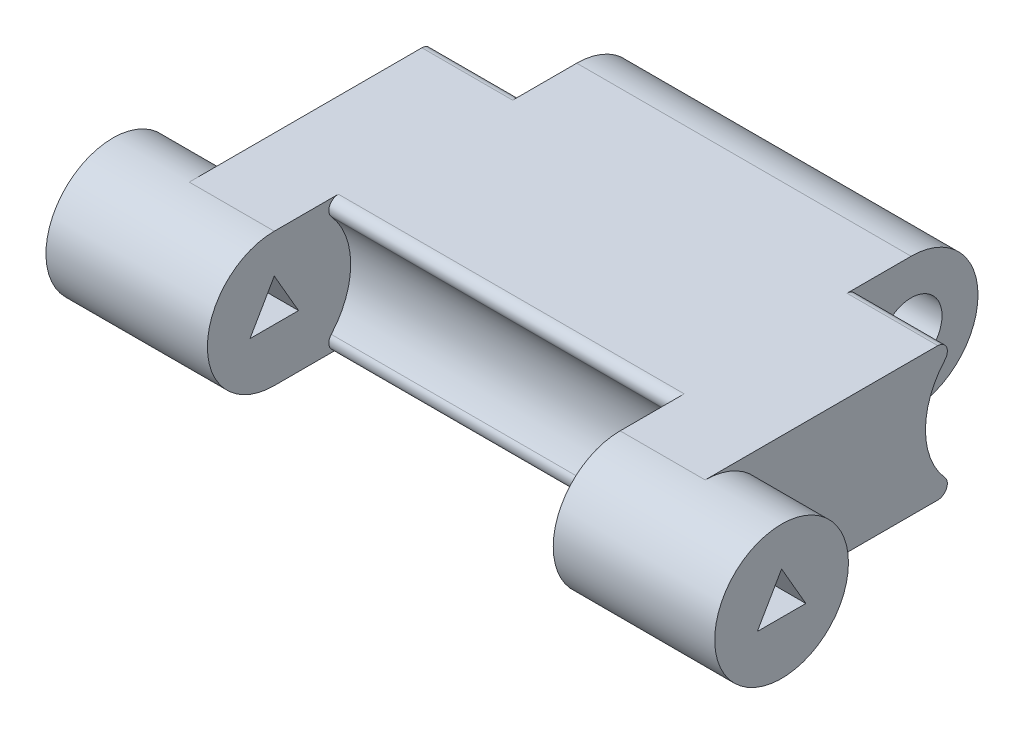
ISO-10303-21;
HEADER;
FILE_DESCRIPTION(('STEP AP214'),'2;1');
FILE_NAME('part.step','',(''),(''),'','','');
FILE_SCHEMA(('AUTOMOTIVE_DESIGN { 1 0 10303 214 1 1 1 1 }'));
ENDSEC;
DATA;
#1=APPLICATION_CONTEXT('core data for automotive mechanical design processes');
#2=APPLICATION_PROTOCOL_DEFINITION('international standard','automotive_design',2000,#1);
#3=PRODUCT_CONTEXT('',#1,'mechanical');
#4=PRODUCT('Part','Part','',(#3));
#5=PRODUCT_RELATED_PRODUCT_CATEGORY('part','',(#4));
#6=PRODUCT_DEFINITION_FORMATION('','',#4);
#7=PRODUCT_DEFINITION_CONTEXT('part definition',#1,'design');
#8=PRODUCT_DEFINITION('design','',#6,#7);
#9=PRODUCT_DEFINITION_SHAPE('','',#8);
#10=(LENGTH_UNIT() NAMED_UNIT(*) SI_UNIT(.MILLI.,.METRE.));
#11=(NAMED_UNIT(*) PLANE_ANGLE_UNIT() SI_UNIT($,.RADIAN.));
#12=(NAMED_UNIT(*) SI_UNIT($,.STERADIAN.) SOLID_ANGLE_UNIT());
#13=UNCERTAINTY_MEASURE_WITH_UNIT(LENGTH_MEASURE(1.E-05),#10,'distance_accuracy_value','');
#14=(GEOMETRIC_REPRESENTATION_CONTEXT(3) GLOBAL_UNCERTAINTY_ASSIGNED_CONTEXT((#13)) GLOBAL_UNIT_ASSIGNED_CONTEXT((#10,
#11,#12)) REPRESENTATION_CONTEXT('',''));
#15=CARTESIAN_POINT('',(0.,0.,0.));
#16=DIRECTION('',(0.,0.,1.));
#17=DIRECTION('',(1.,0.,0.));
#18=AXIS2_PLACEMENT_3D('',#15,#16,#17);
#19=CARTESIAN_POINT('',(-17.5,2.76666666666667,6.49482940778282));
#20=DIRECTION('',(0.,-1.,0.));
#21=DIRECTION('',(0.,0.,-1.));
#22=AXIS2_PLACEMENT_3D('',#19,#20,#21);
#23=PLANE('',#22);
#24=DIRECTION('',(0.,0.,-1.));
#25=VECTOR('',#24,1.);
#26=CARTESIAN_POINT('',(-16.5,2.76666666666667,6.49482940778282));
#27=LINE('',#26,#25);
#28=CARTESIAN_POINT('',(-16.5,2.76666666666667,9.03517059221718));
#29=VERTEX_POINT('',#28);
#30=CARTESIAN_POINT('',(-16.5,2.76666666666667,7.92223301886761));
#31=VERTEX_POINT('',#30);
#32=EDGE_CURVE('E248',#29,#31,#27,.T.);
#33=ORIENTED_EDGE('',*,*,#32,.F.);
#34=DIRECTION('',(1.,0.,0.));
#35=VECTOR('',#34,1.);
#36=CARTESIAN_POINT('',(-17.5,2.76666666666667,9.03517059221718));
#37=LINE('',#36,#35);
#38=CARTESIAN_POINT('',(-9.05,2.76666666666667,9.03517059221718));
#39=VERTEX_POINT('',#38);
#40=EDGE_CURVE('E245',#29,#39,#37,.T.);
#41=ORIENTED_EDGE('',*,*,#40,.T.);
#42=DIRECTION('',(0.,0.,-1.));
#43=VECTOR('',#42,1.);
#44=CARTESIAN_POINT('',(-9.05,2.76666666666667,7.765));
#45=LINE('',#44,#43);
#46=CARTESIAN_POINT('',(-9.05,2.76666666666667,6.49482940778282));
#47=VERTEX_POINT('',#46);
#48=EDGE_CURVE('E436',#39,#47,#45,.T.);
#49=ORIENTED_EDGE('',*,*,#48,.T.);
#50=DIRECTION('',(1.,0.,0.));
#51=VECTOR('',#50,1.);
#52=CARTESIAN_POINT('',(-17.5,2.76666666666667,6.49482940778282));
#53=LINE('',#52,#51);
#54=CARTESIAN_POINT('',(-16.5,2.76666666666667,6.49482940778282));
#55=VERTEX_POINT('',#54);
#56=EDGE_CURVE('E456',#55,#47,#53,.T.);
#57=ORIENTED_EDGE('',*,*,#56,.F.);
#58=CARTESIAN_POINT('',(-16.5,2.76666666666667,7.60776698113239));
#59=VERTEX_POINT('',#58);
#60=EDGE_CURVE('E64',#59,#55,#27,.T.);
#61=ORIENTED_EDGE('',*,*,#60,.F.);
#62=DIRECTION('',(-1.,0.,0.));
#63=VECTOR('',#62,1.);
#64=CARTESIAN_POINT('',(-16.5,2.76666666666667,7.60776698113239));
#65=LINE('',#64,#63);
#66=CARTESIAN_POINT('',(-17.5,2.76666666666667,7.60776698113239));
#67=VERTEX_POINT('',#66);
#68=EDGE_CURVE('E472',#67,#59,#65,.F.);
#69=ORIENTED_EDGE('',*,*,#68,.F.);
#70=DIRECTION('',(0.,0.,-1.));
#71=VECTOR('',#70,1.);
#72=CARTESIAN_POINT('',(-17.5,2.76666666666667,6.49482940778282));
#73=LINE('',#72,#71);
#74=CARTESIAN_POINT('',(-17.5,2.76666666666667,7.92223301886761));
#75=VERTEX_POINT('',#74);
#76=EDGE_CURVE('E448',#75,#67,#73,.T.);
#77=ORIENTED_EDGE('',*,*,#76,.F.);
#78=DIRECTION('',(-1.,0.,0.));
#79=VECTOR('',#78,1.);
#80=CARTESIAN_POINT('',(-16.5,2.76666666666667,7.92223301886761));
#81=LINE('',#80,#79);
#82=EDGE_CURVE('E57',#31,#75,#81,.T.);
#83=ORIENTED_EDGE('',*,*,#82,.F.);
#84=EDGE_LOOP('',(#33,#41,#49,#57,#61,#69,#77,#83));
#85=FACE_BOUND('',#84,.T.);
#86=ADVANCED_FACE('F41',(#85),#23,.F.);
#87=CARTESIAN_POINT('',(-17.5,2.76666666666667,9.03517059221718));
#88=DIRECTION('',(0.,0.5,0.866025403784439));
#89=DIRECTION('',(0.,-0.866025403784439,0.5));
#90=AXIS2_PLACEMENT_3D('',#87,#88,#89);
#91=PLANE('',#90);
#92=DIRECTION('',(0.,-0.866025403784439,0.5));
#93=VECTOR('',#92,1.);
#94=CARTESIAN_POINT('',(-16.5,2.76666666666667,9.03517059221718));
#95=LINE('',#94,#93);
#96=CARTESIAN_POINT('',(-16.5,4.96666666666667,7.765));
#97=VERTEX_POINT('',#96);
#98=CARTESIAN_POINT('',(-16.5,4.00283445531973,8.32146878667479));
#99=VERTEX_POINT('',#98);
#100=EDGE_CURVE('E250',#97,#99,#95,.T.);
#101=ORIENTED_EDGE('',*,*,#100,.F.);
#102=DIRECTION('',(1.,0.,0.));
#103=VECTOR('',#102,1.);
#104=CARTESIAN_POINT('',(-17.5,4.96666666666667,7.765));
#105=LINE('',#104,#103);
#106=CARTESIAN_POINT('',(-9.05,4.96666666666667,7.765));
#107=VERTEX_POINT('',#106);
#108=EDGE_CURVE('E466',#97,#107,#105,.T.);
#109=ORIENTED_EDGE('',*,*,#108,.T.);
#110=DIRECTION('',(0.,-0.866025403784439,0.5));
#111=VECTOR('',#110,1.);
#112=CARTESIAN_POINT('',(-9.05,3.86666666666667,8.40008529610859));
#113=LINE('',#112,#111);
#114=EDGE_CURVE('E441',#107,#39,#113,.T.);
#115=ORIENTED_EDGE('',*,*,#114,.T.);
#116=ORIENTED_EDGE('',*,*,#40,.F.);
#117=CARTESIAN_POINT('',(-16.5,3.7304988780136,8.47870180554239));
#118=VERTEX_POINT('',#117);
#119=EDGE_CURVE('E239',#118,#29,#95,.T.);
#120=ORIENTED_EDGE('',*,*,#119,.F.);
#121=DIRECTION('',(-1.,0.,0.));
#122=VECTOR('',#121,1.);
#123=CARTESIAN_POINT('',(-16.5,3.7304988780136,8.47870180554239));
#124=LINE('',#123,#122);
#125=CARTESIAN_POINT('',(-17.5,3.7304988780136,8.47870180554239));
#126=VERTEX_POINT('',#125);
#127=EDGE_CURVE('E242',#126,#118,#124,.F.);
#128=ORIENTED_EDGE('',*,*,#127,.F.);
#129=DIRECTION('',(0.,-0.866025403784439,0.5));
#130=VECTOR('',#129,1.);
#131=CARTESIAN_POINT('',(-17.5,2.76666666666667,9.03517059221718));
#132=LINE('',#131,#130);
#133=CARTESIAN_POINT('',(-17.5,4.00283445531973,8.32146878667479));
#134=VERTEX_POINT('',#133);
#135=EDGE_CURVE('E454',#134,#126,#132,.T.);
#136=ORIENTED_EDGE('',*,*,#135,.F.);
#137=DIRECTION('',(-1.,0.,0.));
#138=VECTOR('',#137,1.);
#139=CARTESIAN_POINT('',(-16.5,4.00283445531973,8.32146878667479));
#140=LINE('',#139,#138);
#141=EDGE_CURVE('E258',#99,#134,#140,.T.);
#142=ORIENTED_EDGE('',*,*,#141,.F.);
#143=EDGE_LOOP('',(#101,#109,#115,#116,#120,#128,#136,#142));
#144=FACE_BOUND('',#143,.T.);
#145=ADVANCED_FACE('F241',(#144),#91,.F.);
#146=CARTESIAN_POINT('',(-17.5,4.96666666666667,7.765));
#147=DIRECTION('',(0.,0.5,-0.866025403784438));
#148=DIRECTION('',(0.,0.866025403784438,0.5));
#149=AXIS2_PLACEMENT_3D('',#146,#147,#148);
#150=PLANE('',#149);
#151=DIRECTION('',(0.,0.866025403784438,0.5));
#152=VECTOR('',#151,1.);
#153=CARTESIAN_POINT('',(-16.5,4.96666666666667,7.765));
#154=LINE('',#153,#152);
#155=CARTESIAN_POINT('',(-16.5,3.7304988780136,7.05129819445761));
#156=VERTEX_POINT('',#155);
#157=EDGE_CURVE('E11',#55,#156,#154,.T.);
#158=ORIENTED_EDGE('',*,*,#157,.F.);
#159=ORIENTED_EDGE('',*,*,#56,.T.);
#160=DIRECTION('',(0.,0.866025403784438,0.5));
#161=VECTOR('',#160,1.);
#162=CARTESIAN_POINT('',(-9.05,3.86666666666667,7.12991470389141));
#163=LINE('',#162,#161);
#164=EDGE_CURVE('E443',#47,#107,#163,.T.);
#165=ORIENTED_EDGE('',*,*,#164,.T.);
#166=ORIENTED_EDGE('',*,*,#108,.F.);
#167=CARTESIAN_POINT('',(-16.5,4.00283445531973,7.20853121332521));
#168=VERTEX_POINT('',#167);
#169=EDGE_CURVE('E50',#168,#97,#154,.T.);
#170=ORIENTED_EDGE('',*,*,#169,.F.);
#171=DIRECTION('',(-1.,0.,0.));
#172=VECTOR('',#171,1.);
#173=CARTESIAN_POINT('',(-16.5,4.00283445531973,7.20853121332521));
#174=LINE('',#173,#172);
#175=CARTESIAN_POINT('',(-17.5,4.00283445531973,7.20853121332521));
#176=VERTEX_POINT('',#175);
#177=EDGE_CURVE('E280',#176,#168,#174,.F.);
#178=ORIENTED_EDGE('',*,*,#177,.F.);
#179=DIRECTION('',(0.,0.866025403784438,0.5));
#180=VECTOR('',#179,1.);
#181=CARTESIAN_POINT('',(-17.5,4.96666666666667,7.765));
#182=LINE('',#181,#180);
#183=CARTESIAN_POINT('',(-17.5,3.7304988780136,7.05129819445761));
#184=VERTEX_POINT('',#183);
#185=EDGE_CURVE('E452',#184,#176,#182,.T.);
#186=ORIENTED_EDGE('',*,*,#185,.F.);
#187=DIRECTION('',(-1.,0.,0.));
#188=VECTOR('',#187,1.);
#189=CARTESIAN_POINT('',(-16.5,3.7304988780136,7.05129819445761));
#190=LINE('',#189,#188);
#191=EDGE_CURVE('E45',#156,#184,#190,.T.);
#192=ORIENTED_EDGE('',*,*,#191,.F.);
#193=EDGE_LOOP('',(#158,#159,#165,#166,#170,#178,#186,#192));
#194=FACE_BOUND('',#193,.T.);
#195=ADVANCED_FACE('F490',(#194),#150,.F.);
#196=CARTESIAN_POINT('',(17.5,3.5,-7.765));
#197=DIRECTION('',(-1.,0.,0.));
#198=DIRECTION('',(0.,0.,1.));
#199=AXIS2_PLACEMENT_3D('',#196,#197,#198);
#200=CYLINDRICAL_SURFACE('',#199,3.5);
#201=CARTESIAN_POINT('',(-8.75,3.5,-7.765));
#202=DIRECTION('',(-1.,0.,0.));
#203=DIRECTION('',(0.,0.,1.));
#204=AXIS2_PLACEMENT_3D('',#201,#202,#203);
#205=CIRCLE('',#204,3.5);
#206=CARTESIAN_POINT('',(-8.75,7.,-7.765));
#207=VERTEX_POINT('',#206);
#208=CARTESIAN_POINT('',(-8.75,0.,-7.765));
#209=VERTEX_POINT('',#208);
#210=EDGE_CURVE('E430',#207,#209,#205,.T.);
#211=ORIENTED_EDGE('',*,*,#210,.F.);
#212=DIRECTION('',(-1.,0.,0.));
#213=VECTOR('',#212,1.);
#214=CARTESIAN_POINT('',(17.5,7.,-7.765));
#215=LINE('',#214,#213);
#216=CARTESIAN_POINT('',(8.75,7.,-7.765));
#217=VERTEX_POINT('',#216);
#218=EDGE_CURVE('E376',#217,#207,#215,.T.);
#219=ORIENTED_EDGE('',*,*,#218,.F.);
#220=CARTESIAN_POINT('',(8.75,3.5,-7.765));
#221=DIRECTION('',(1.,0.,0.));
#222=DIRECTION('',(0.,0.,-1.));
#223=AXIS2_PLACEMENT_3D('',#220,#221,#222);
#224=CIRCLE('',#223,3.5);
#225=CARTESIAN_POINT('',(8.75,0.,-7.765));
#226=VERTEX_POINT('',#225);
#227=EDGE_CURVE('E360',#226,#217,#224,.T.);
#228=ORIENTED_EDGE('',*,*,#227,.F.);
#229=DIRECTION('',(-1.,0.,0.));
#230=VECTOR('',#229,1.);
#231=CARTESIAN_POINT('',(17.5,0.,-7.765));
#232=LINE('',#231,#230);
#233=EDGE_CURVE('E373',#226,#209,#232,.T.);
#234=ORIENTED_EDGE('',*,*,#233,.T.);
#235=EDGE_LOOP('',(#211,#219,#228,#234));
#236=FACE_BOUND('',#235,.T.);
#237=ADVANCED_FACE('F563',(#236),#200,.T.);
#238=CARTESIAN_POINT('',(17.5,0.,7.765));
#239=DIRECTION('',(0.,1.,0.));
#240=DIRECTION('',(0.,0.,1.));
#241=AXIS2_PLACEMENT_3D('',#238,#239,#240);
#242=PLANE('',#241);
#243=DIRECTION('',(0.,0.,1.));
#244=VECTOR('',#243,1.);
#245=CARTESIAN_POINT('',(-13.5,0.,7.765));
#246=LINE('',#245,#244);
#247=CARTESIAN_POINT('',(-13.5,0.,-4.41089803375031));
#248=VERTEX_POINT('',#247);
#249=CARTESIAN_POINT('',(-13.5,0.,7.765));
#250=VERTEX_POINT('',#249);
#251=EDGE_CURVE('E395',#248,#250,#246,.T.);
#252=ORIENTED_EDGE('',*,*,#251,.F.);
#253=DIRECTION('',(1.,0.,0.));
#254=VECTOR('',#253,1.);
#255=CARTESIAN_POINT('',(-8.75,0.,-4.41089803375031));
#256=LINE('',#255,#254);
#257=CARTESIAN_POINT('',(-8.75,0.,-4.41089803375031));
#258=VERTEX_POINT('',#257);
#259=EDGE_CURVE('E325',#248,#258,#256,.T.);
#260=ORIENTED_EDGE('',*,*,#259,.T.);
#261=DIRECTION('',(0.,0.,1.));
#262=VECTOR('',#261,1.);
#263=CARTESIAN_POINT('',(-8.75,0.,7.765));
#264=LINE('',#263,#262);
#265=EDGE_CURVE('E426',#209,#258,#264,.T.);
#266=ORIENTED_EDGE('',*,*,#265,.F.);
#267=ORIENTED_EDGE('',*,*,#233,.F.);
#268=DIRECTION('',(0.,0.,-1.));
#269=VECTOR('',#268,1.);
#270=CARTESIAN_POINT('',(8.75,0.,7.765));
#271=LINE('',#270,#269);
#272=CARTESIAN_POINT('',(8.75,0.,-4.41089803375031));
#273=VERTEX_POINT('',#272);
#274=EDGE_CURVE('E416',#273,#226,#271,.T.);
#275=ORIENTED_EDGE('',*,*,#274,.F.);
#276=DIRECTION('',(1.,0.,0.));
#277=VECTOR('',#276,1.);
#278=CARTESIAN_POINT('',(17.5,0.,-4.41089803375031));
#279=LINE('',#278,#277);
#280=CARTESIAN_POINT('',(13.5,0.,-4.41089803375031));
#281=VERTEX_POINT('',#280);
#282=EDGE_CURVE('E331',#273,#281,#279,.T.);
#283=ORIENTED_EDGE('',*,*,#282,.T.);
#284=DIRECTION('',(0.,0.,-1.));
#285=VECTOR('',#284,1.);
#286=CARTESIAN_POINT('',(13.5,0.,7.765));
#287=LINE('',#286,#285);
#288=CARTESIAN_POINT('',(13.5,0.,7.765));
#289=VERTEX_POINT('',#288);
#290=EDGE_CURVE('E387',#289,#281,#287,.T.);
#291=ORIENTED_EDGE('',*,*,#290,.F.);
#292=DIRECTION('',(-1.,0.,0.));
#293=VECTOR('',#292,1.);
#294=CARTESIAN_POINT('',(17.5,0.,7.765));
#295=LINE('',#294,#293);
#296=CARTESIAN_POINT('',(9.05,0.,7.765));
#297=VERTEX_POINT('',#296);
#298=EDGE_CURVE('E369',#289,#297,#295,.T.);
#299=ORIENTED_EDGE('',*,*,#298,.T.);
#300=DIRECTION('',(0.,0.,-1.));
#301=VECTOR('',#300,1.);
#302=CARTESIAN_POINT('',(9.05,0.,7.765));
#303=LINE('',#302,#301);
#304=CARTESIAN_POINT('',(9.05,0.,4.41089803375031));
#305=VERTEX_POINT('',#304);
#306=EDGE_CURVE('E407',#297,#305,#303,.T.);
#307=ORIENTED_EDGE('',*,*,#306,.T.);
#308=DIRECTION('',(1.,0.,0.));
#309=VECTOR('',#308,1.);
#310=CARTESIAN_POINT('',(17.5,0.,4.41089803375031));
#311=LINE('',#310,#309);
#312=CARTESIAN_POINT('',(-9.05,0.,4.41089803375031));
#313=VERTEX_POINT('',#312);
#314=EDGE_CURVE('E328',#305,#313,#311,.F.);
#315=ORIENTED_EDGE('',*,*,#314,.T.);
#316=DIRECTION('',(0.,0.,-1.));
#317=VECTOR('',#316,1.);
#318=CARTESIAN_POINT('',(-9.05,0.,7.765));
#319=LINE('',#318,#317);
#320=CARTESIAN_POINT('',(-9.05,0.,7.765));
#321=VERTEX_POINT('',#320);
#322=EDGE_CURVE('E403',#321,#313,#319,.T.);
#323=ORIENTED_EDGE('',*,*,#322,.F.);
#324=EDGE_CURVE('E372',#321,#250,#295,.T.);
#325=ORIENTED_EDGE('',*,*,#324,.T.);
#326=EDGE_LOOP('',(#252,#260,#266,#267,#275,#283,#291,#299,#307,#315,#323,#325));
#327=FACE_BOUND('',#326,.T.);
#328=ADVANCED_FACE('F542',(#327),#242,.F.);
#329=CARTESIAN_POINT('',(17.5,7.,7.765));
#330=DIRECTION('',(0.,-1.,0.));
#331=DIRECTION('',(0.,0.,-1.));
#332=AXIS2_PLACEMENT_3D('',#329,#330,#331);
#333=PLANE('',#332);
#334=DIRECTION('',(0.,0.,-1.));
#335=VECTOR('',#334,1.);
#336=CARTESIAN_POINT('',(-8.75,7.,7.765));
#337=LINE('',#336,#335);
#338=CARTESIAN_POINT('',(-8.75,7.,-4.41089803375031));
#339=VERTEX_POINT('',#338);
#340=EDGE_CURVE('E353',#339,#207,#337,.T.);
#341=ORIENTED_EDGE('',*,*,#340,.F.);
#342=DIRECTION('',(1.,0.,0.));
#343=VECTOR('',#342,1.);
#344=CARTESIAN_POINT('',(-13.5,7.,-4.41089803375031));
#345=LINE('',#344,#343);
#346=CARTESIAN_POINT('',(-13.5,7.,-4.41089803375031));
#347=VERTEX_POINT('',#346);
#348=EDGE_CURVE('E317',#339,#347,#345,.F.);
#349=ORIENTED_EDGE('',*,*,#348,.T.);
#350=DIRECTION('',(0.,0.,-1.));
#351=VECTOR('',#350,1.);
#352=CARTESIAN_POINT('',(-13.5,7.,7.765));
#353=LINE('',#352,#351);
#354=CARTESIAN_POINT('',(-13.5,7.,7.765));
#355=VERTEX_POINT('',#354);
#356=EDGE_CURVE('E397',#355,#347,#353,.T.);
#357=ORIENTED_EDGE('',*,*,#356,.F.);
#358=DIRECTION('',(-1.,0.,0.));
#359=VECTOR('',#358,1.);
#360=CARTESIAN_POINT('',(17.5,7.,7.765));
#361=LINE('',#360,#359);
#362=CARTESIAN_POINT('',(-9.05,7.,7.765));
#363=VERTEX_POINT('',#362);
#364=EDGE_CURVE('E382',#363,#355,#361,.T.);
#365=ORIENTED_EDGE('',*,*,#364,.F.);
#366=DIRECTION('',(0.,0.,1.));
#367=VECTOR('',#366,1.);
#368=CARTESIAN_POINT('',(-9.05,7.,7.765));
#369=LINE('',#368,#367);
#370=CARTESIAN_POINT('',(-9.05,7.,4.41089803375031));
#371=VERTEX_POINT('',#370);
#372=EDGE_CURVE('E405',#371,#363,#369,.T.);
#373=ORIENTED_EDGE('',*,*,#372,.F.);
#374=DIRECTION('',(1.,0.,0.));
#375=VECTOR('',#374,1.);
#376=CARTESIAN_POINT('',(17.5,7.,4.41089803375031));
#377=LINE('',#376,#375);
#378=CARTESIAN_POINT('',(9.05,7.,4.41089803375031));
#379=VERTEX_POINT('',#378);
#380=EDGE_CURVE('E319',#371,#379,#377,.T.);
#381=ORIENTED_EDGE('',*,*,#380,.T.);
#382=DIRECTION('',(0.,0.,1.));
#383=VECTOR('',#382,1.);
#384=CARTESIAN_POINT('',(9.05,7.,7.765));
#385=LINE('',#384,#383);
#386=CARTESIAN_POINT('',(9.05,7.,7.765));
#387=VERTEX_POINT('',#386);
#388=EDGE_CURVE('E409',#379,#387,#385,.T.);
#389=ORIENTED_EDGE('',*,*,#388,.T.);
#390=CARTESIAN_POINT('',(13.5,7.,7.765));
#391=VERTEX_POINT('',#390);
#392=EDGE_CURVE('E379',#391,#387,#361,.T.);
#393=ORIENTED_EDGE('',*,*,#392,.F.);
#394=DIRECTION('',(0.,0.,1.));
#395=VECTOR('',#394,1.);
#396=CARTESIAN_POINT('',(13.5,7.,7.765));
#397=LINE('',#396,#395);
#398=CARTESIAN_POINT('',(13.5,7.,-4.41089803375031));
#399=VERTEX_POINT('',#398);
#400=EDGE_CURVE('E367',#399,#391,#397,.T.);
#401=ORIENTED_EDGE('',*,*,#400,.F.);
#402=DIRECTION('',(1.,0.,0.));
#403=VECTOR('',#402,1.);
#404=CARTESIAN_POINT('',(17.5,7.,-4.41089803375031));
#405=LINE('',#404,#403);
#406=CARTESIAN_POINT('',(8.75,7.,-4.41089803375031));
#407=VERTEX_POINT('',#406);
#408=EDGE_CURVE('E322',#399,#407,#405,.F.);
#409=ORIENTED_EDGE('',*,*,#408,.T.);
#410=DIRECTION('',(0.,0.,1.));
#411=VECTOR('',#410,1.);
#412=CARTESIAN_POINT('',(8.75,7.,7.765));
#413=LINE('',#412,#411);
#414=EDGE_CURVE('E420',#217,#407,#413,.T.);
#415=ORIENTED_EDGE('',*,*,#414,.F.);
#416=ORIENTED_EDGE('',*,*,#218,.T.);
#417=EDGE_LOOP('',(#341,#349,#357,#365,#373,#381,#389,#393,#401,#409,#415,#416));
#418=FACE_BOUND('',#417,.T.);
#419=ADVANCED_FACE('F531',(#418),#333,.F.);
#420=CARTESIAN_POINT('',(17.5,3.5,7.765));
#421=DIRECTION('',(-1.,0.,0.));
#422=DIRECTION('',(0.,0.,1.));
#423=AXIS2_PLACEMENT_3D('',#420,#421,#422);
#424=CYLINDRICAL_SURFACE('',#423,3.5);
#425=CARTESIAN_POINT('',(-17.5,3.5,7.765));
#426=DIRECTION('',(1.,0.,0.));
#427=DIRECTION('',(0.,0.,-1.));
#428=AXIS2_PLACEMENT_3D('',#425,#426,#427);
#429=CIRCLE('',#428,3.5);
#430=CARTESIAN_POINT('',(-17.5,3.5,4.265));
#431=VERTEX_POINT('',#430);
#432=EDGE_CURVE('E383',#431,#431,#429,.T.);
#433=ORIENTED_EDGE('',*,*,#432,.T.);
#434=EDGE_LOOP('',(#433));
#435=FACE_BOUND('',#434,.T.);
#436=CARTESIAN_POINT('',(-9.05,3.5,7.765));
#437=DIRECTION('',(1.,0.,0.));
#438=DIRECTION('',(0.,0.,-1.));
#439=AXIS2_PLACEMENT_3D('',#436,#437,#438);
#440=CIRCLE('',#439,3.5);
#441=EDGE_CURVE('E362',#363,#321,#440,.T.);
#442=ORIENTED_EDGE('',*,*,#441,.F.);
#443=ORIENTED_EDGE('',*,*,#364,.T.);
#444=CARTESIAN_POINT('',(-13.5,3.5,7.765));
#445=DIRECTION('',(1.,0.,0.));
#446=DIRECTION('',(0.,0.,-1.));
#447=AXIS2_PLACEMENT_3D('',#444,#445,#446);
#448=CIRCLE('',#447,3.5);
#449=EDGE_CURVE('E400',#250,#355,#448,.T.);
#450=ORIENTED_EDGE('',*,*,#449,.F.);
#451=ORIENTED_EDGE('',*,*,#324,.F.);
#452=EDGE_LOOP('',(#442,#443,#450,#451));
#453=FACE_BOUND('',#452,.T.);
#454=ADVANCED_FACE('F587',(#435,#453),#424,.T.);
#455=CARTESIAN_POINT('',(-17.5,3.5,7.765));
#456=DIRECTION('',(1.,0.,0.));
#457=DIRECTION('',(0.,0.,-1.));
#458=AXIS2_PLACEMENT_3D('',#455,#456,#457);
#459=PLANE('',#458);
#460=CARTESIAN_POINT('',(-17.5,3.5,7.765));
#461=DIRECTION('',(-1.,0.,0.));
#462=DIRECTION('',(0.,0.,1.));
#463=AXIS2_PLACEMENT_3D('',#460,#461,#462);
#464=CIRCLE('',#463,0.749999999999999);
#465=EDGE_CURVE('E257',#75,#126,#464,.T.);
#466=ORIENTED_EDGE('',*,*,#465,.F.);
#467=ORIENTED_EDGE('',*,*,#76,.T.);
#468=EDGE_CURVE('E267',#184,#67,#464,.T.);
#469=ORIENTED_EDGE('',*,*,#468,.F.);
#470=ORIENTED_EDGE('',*,*,#185,.T.);
#471=EDGE_CURVE('E263',#134,#176,#464,.T.);
#472=ORIENTED_EDGE('',*,*,#471,.F.);
#473=ORIENTED_EDGE('',*,*,#135,.T.);
#474=EDGE_LOOP('',(#466,#467,#469,#470,#472,#473));
#475=FACE_BOUND('',#474,.T.);
#476=ORIENTED_EDGE('',*,*,#432,.F.);
#477=EDGE_LOOP('',(#476));
#478=FACE_BOUND('',#477,.T.);
#479=ADVANCED_FACE('F481',(#475,#478),#459,.F.);
#480=CARTESIAN_POINT('',(17.5,3.5,7.765));
#481=DIRECTION('',(1.,0.,0.));
#482=DIRECTION('',(0.,0.,-1.));
#483=AXIS2_PLACEMENT_3D('',#480,#481,#482);
#484=PLANE('',#483);
#485=DIRECTION('',(0.,0.,-1.));
#486=VECTOR('',#485,1.);
#487=CARTESIAN_POINT('',(17.5,2.76666666666667,6.49482940778282));
#488=LINE('',#487,#486);
#489=CARTESIAN_POINT('',(17.5,2.76666666666667,9.03517059221718));
#490=VERTEX_POINT('',#489);
#491=CARTESIAN_POINT('',(17.5,2.76666666666667,6.49482940778282));
#492=VERTEX_POINT('',#491);
#493=EDGE_CURVE('E358',#490,#492,#488,.T.);
#494=ORIENTED_EDGE('',*,*,#493,.F.);
#495=DIRECTION('',(0.,-0.866025403784439,0.5));
#496=VECTOR('',#495,1.);
#497=CARTESIAN_POINT('',(17.5,2.76666666666667,9.03517059221718));
#498=LINE('',#497,#496);
#499=CARTESIAN_POINT('',(17.5,4.96666666666667,7.765));
#500=VERTEX_POINT('',#499);
#501=EDGE_CURVE('E451',#500,#490,#498,.T.);
#502=ORIENTED_EDGE('',*,*,#501,.F.);
#503=DIRECTION('',(0.,0.866025403784438,0.5));
#504=VECTOR('',#503,1.);
#505=CARTESIAN_POINT('',(17.5,4.96666666666667,7.765));
#506=LINE('',#505,#504);
#507=EDGE_CURVE('E458',#492,#500,#506,.T.);
#508=ORIENTED_EDGE('',*,*,#507,.F.);
#509=EDGE_LOOP('',(#494,#502,#508));
#510=FACE_BOUND('',#509,.T.);
#511=CARTESIAN_POINT('',(17.5,3.5,7.765));
#512=DIRECTION('',(1.,0.,0.));
#513=DIRECTION('',(0.,0.,-1.));
#514=AXIS2_PLACEMENT_3D('',#511,#512,#513);
#515=CIRCLE('',#514,3.5);
#516=CARTESIAN_POINT('',(17.5,3.5,4.265));
#517=VERTEX_POINT('',#516);
#518=EDGE_CURVE('E386',#517,#517,#515,.T.);
#519=ORIENTED_EDGE('',*,*,#518,.T.);
#520=EDGE_LOOP('',(#519));
#521=FACE_BOUND('',#520,.T.);
#522=ADVANCED_FACE('F516',(#510,#521),#484,.T.);
#523=ORIENTED_EDGE('',*,*,#392,.T.);
#524=CARTESIAN_POINT('',(9.05,3.5,7.765));
#525=DIRECTION('',(1.,0.,0.));
#526=DIRECTION('',(0.,0.,-1.));
#527=AXIS2_PLACEMENT_3D('',#524,#525,#526);
#528=CIRCLE('',#527,3.5);
#529=EDGE_CURVE('E364',#387,#297,#528,.T.);
#530=ORIENTED_EDGE('',*,*,#529,.T.);
#531=ORIENTED_EDGE('',*,*,#298,.F.);
#532=CARTESIAN_POINT('',(13.5,3.5,7.765));
#533=DIRECTION('',(1.,0.,0.));
#534=DIRECTION('',(0.,0.,-1.));
#535=AXIS2_PLACEMENT_3D('',#532,#533,#534);
#536=CIRCLE('',#535,3.5);
#537=EDGE_CURVE('E392',#289,#391,#536,.T.);
#538=ORIENTED_EDGE('',*,*,#537,.T.);
#539=EDGE_LOOP('',(#523,#530,#531,#538));
#540=FACE_BOUND('',#539,.T.);
#541=ORIENTED_EDGE('',*,*,#518,.F.);
#542=EDGE_LOOP('',(#541));
#543=FACE_BOUND('',#542,.T.);
#544=ADVANCED_FACE('F534',(#540,#543),#424,.T.);
#545=CARTESIAN_POINT('',(13.5,0.,0.));
#546=DIRECTION('',(1.,0.,0.));
#547=DIRECTION('',(0.,0.,-1.));
#548=AXIS2_PLACEMENT_3D('',#545,#546,#547);
#549=PLANE('',#548);
#550=CARTESIAN_POINT('',(13.5,3.5,-7.765));
#551=DIRECTION('',(1.,0.,0.));
#552=DIRECTION('',(0.,0.,-1.));
#553=AXIS2_PLACEMENT_3D('',#550,#551,#552);
#554=CIRCLE('',#553,4.);
#555=CARTESIAN_POINT('',(13.5,6.16666666666667,-4.78357603000028));
#556=VERTEX_POINT('',#555);
#557=CARTESIAN_POINT('',(13.5,0.833333333333337,-4.78357603000028));
#558=VERTEX_POINT('',#557);
#559=EDGE_CURVE('E423',#556,#558,#554,.T.);
#560=ORIENTED_EDGE('',*,*,#559,.F.);
#561=CARTESIAN_POINT('',(13.5,6.5,-4.41089803375031));
#562=DIRECTION('',(1.,0.,0.));
#563=DIRECTION('',(0.,0.,-1.));
#564=AXIS2_PLACEMENT_3D('',#561,#562,#563);
#565=CIRCLE('',#564,0.5);
#566=EDGE_CURVE('E305',#556,#399,#565,.T.);
#567=ORIENTED_EDGE('',*,*,#566,.T.);
#568=ORIENTED_EDGE('',*,*,#400,.T.);
#569=ORIENTED_EDGE('',*,*,#537,.F.);
#570=ORIENTED_EDGE('',*,*,#290,.T.);
#571=CARTESIAN_POINT('',(13.5,0.500000000000003,-4.41089803375031));
#572=DIRECTION('',(1.,0.,0.));
#573=DIRECTION('',(0.,0.,-1.));
#574=AXIS2_PLACEMENT_3D('',#571,#572,#573);
#575=CIRCLE('',#574,0.5);
#576=EDGE_CURVE('E307',#281,#558,#575,.T.);
#577=ORIENTED_EDGE('',*,*,#576,.T.);
#578=EDGE_LOOP('',(#560,#567,#568,#569,#570,#577));
#579=FACE_BOUND('',#578,.T.);
#580=ADVANCED_FACE('F539',(#579),#549,.T.);
#581=CARTESIAN_POINT('',(-13.5,0.,0.));
#582=DIRECTION('',(-1.,0.,0.));
#583=DIRECTION('',(0.,0.,-1.));
#584=AXIS2_PLACEMENT_3D('',#581,#582,#583);
#585=PLANE('',#584);
#586=CARTESIAN_POINT('',(-13.5,3.5,-7.765));
#587=DIRECTION('',(1.,0.,0.));
#588=DIRECTION('',(0.,0.,-1.));
#589=AXIS2_PLACEMENT_3D('',#586,#587,#588);
#590=CIRCLE('',#589,4.);
#591=CARTESIAN_POINT('',(-13.5,6.16666666666667,-4.78357603000028));
#592=VERTEX_POINT('',#591);
#593=CARTESIAN_POINT('',(-13.5,0.833333333333337,-4.78357603000028));
#594=VERTEX_POINT('',#593);
#595=EDGE_CURVE('E433',#592,#594,#590,.T.);
#596=ORIENTED_EDGE('',*,*,#595,.T.);
#597=CARTESIAN_POINT('',(-13.5,0.500000000000003,-4.41089803375031));
#598=DIRECTION('',(-1.,0.,0.));
#599=DIRECTION('',(0.,0.,1.));
#600=AXIS2_PLACEMENT_3D('',#597,#598,#599);
#601=CIRCLE('',#600,0.5);
#602=EDGE_CURVE('E334',#594,#248,#601,.T.);
#603=ORIENTED_EDGE('',*,*,#602,.T.);
#604=ORIENTED_EDGE('',*,*,#251,.T.);
#605=ORIENTED_EDGE('',*,*,#449,.T.);
#606=ORIENTED_EDGE('',*,*,#356,.T.);
#607=CARTESIAN_POINT('',(-13.5,6.5,-4.41089803375031));
#608=DIRECTION('',(-1.,0.,0.));
#609=DIRECTION('',(0.,0.,1.));
#610=AXIS2_PLACEMENT_3D('',#607,#608,#609);
#611=CIRCLE('',#610,0.5);
#612=EDGE_CURVE('E336',#347,#592,#611,.T.);
#613=ORIENTED_EDGE('',*,*,#612,.T.);
#614=EDGE_LOOP('',(#596,#603,#604,#605,#606,#613));
#615=FACE_BOUND('',#614,.T.);
#616=ADVANCED_FACE('F582',(#615),#585,.T.);
#617=CARTESIAN_POINT('',(-9.05,3.5,7.765));
#618=DIRECTION('',(1.,0.,0.));
#619=DIRECTION('',(0.,0.,-1.));
#620=AXIS2_PLACEMENT_3D('',#617,#618,#619);
#621=CYLINDRICAL_SURFACE('',#620,4.);
#622=CARTESIAN_POINT('',(9.05,3.5,7.765));
#623=DIRECTION('',(1.,0.,0.));
#624=DIRECTION('',(0.,0.,-1.));
#625=AXIS2_PLACEMENT_3D('',#622,#623,#624);
#626=CIRCLE('',#625,4.);
#627=CARTESIAN_POINT('',(9.05,0.833333333333335,4.78357603000028));
#628=VERTEX_POINT('',#627);
#629=CARTESIAN_POINT('',(9.05,6.16666666666667,4.78357603000028));
#630=VERTEX_POINT('',#629);
#631=EDGE_CURVE('E413',#628,#630,#626,.T.);
#632=ORIENTED_EDGE('',*,*,#631,.T.);
#633=DIRECTION('',(1.,0.,0.));
#634=VECTOR('',#633,1.);
#635=CARTESIAN_POINT('',(-9.05,6.16666666666667,4.78357603000028));
#636=LINE('',#635,#634);
#637=CARTESIAN_POINT('',(-9.05,6.16666666666667,4.78357603000028));
#638=VERTEX_POINT('',#637);
#639=EDGE_CURVE('E313',#630,#638,#636,.F.);
#640=ORIENTED_EDGE('',*,*,#639,.T.);
#641=CARTESIAN_POINT('',(-9.05,3.5,7.765));
#642=DIRECTION('',(1.,0.,0.));
#643=DIRECTION('',(0.,0.,-1.));
#644=AXIS2_PLACEMENT_3D('',#641,#642,#643);
#645=CIRCLE('',#644,4.);
#646=CARTESIAN_POINT('',(-9.05,0.833333333333335,4.78357603000028));
#647=VERTEX_POINT('',#646);
#648=EDGE_CURVE('E412',#647,#638,#645,.T.);
#649=ORIENTED_EDGE('',*,*,#648,.F.);
#650=DIRECTION('',(1.,0.,0.));
#651=VECTOR('',#650,1.);
#652=CARTESIAN_POINT('',(-9.05,0.833333333333336,4.78357603000028));
#653=LINE('',#652,#651);
#654=EDGE_CURVE('E315',#647,#628,#653,.T.);
#655=ORIENTED_EDGE('',*,*,#654,.T.);
#656=EDGE_LOOP('',(#632,#640,#649,#655));
#657=FACE_BOUND('',#656,.T.);
#658=ADVANCED_FACE('F597',(#657),#621,.F.);
#659=CARTESIAN_POINT('',(-9.05,3.5,7.765));
#660=DIRECTION('',(1.,0.,0.));
#661=DIRECTION('',(0.,0.,-1.));
#662=AXIS2_PLACEMENT_3D('',#659,#660,#661);
#663=PLANE('',#662);
#664=ORIENTED_EDGE('',*,*,#48,.F.);
#665=ORIENTED_EDGE('',*,*,#114,.F.);
#666=ORIENTED_EDGE('',*,*,#164,.F.);
#667=EDGE_LOOP('',(#664,#665,#666));
#668=FACE_BOUND('',#667,.T.);
#669=ORIENTED_EDGE('',*,*,#322,.T.);
#670=CARTESIAN_POINT('',(-9.05,0.500000000000002,4.41089803375031));
#671=DIRECTION('',(1.,0.,0.));
#672=DIRECTION('',(0.,0.,-1.));
#673=AXIS2_PLACEMENT_3D('',#670,#671,#672);
#674=CIRCLE('',#673,0.5);
#675=EDGE_CURVE('E293',#313,#647,#674,.F.);
#676=ORIENTED_EDGE('',*,*,#675,.T.);
#677=ORIENTED_EDGE('',*,*,#648,.T.);
#678=CARTESIAN_POINT('',(-9.05,6.5,4.41089803375031));
#679=DIRECTION('',(1.,0.,0.));
#680=DIRECTION('',(0.,0.,-1.));
#681=AXIS2_PLACEMENT_3D('',#678,#679,#680);
#682=CIRCLE('',#681,0.5);
#683=EDGE_CURVE('E295',#638,#371,#682,.F.);
#684=ORIENTED_EDGE('',*,*,#683,.T.);
#685=ORIENTED_EDGE('',*,*,#372,.T.);
#686=ORIENTED_EDGE('',*,*,#441,.T.);
#687=EDGE_LOOP('',(#669,#676,#677,#684,#685,#686));
#688=FACE_BOUND('',#687,.T.);
#689=ADVANCED_FACE('F524',(#668,#688),#663,.T.);
#690=CARTESIAN_POINT('',(9.05,3.5,7.765));
#691=DIRECTION('',(1.,0.,0.));
#692=DIRECTION('',(0.,0.,-1.));
#693=AXIS2_PLACEMENT_3D('',#690,#691,#692);
#694=PLANE('',#693);
#695=DIRECTION('',(0.,-0.866025403784439,0.5));
#696=VECTOR('',#695,1.);
#697=CARTESIAN_POINT('',(9.05,3.86666666666667,8.40008529610859));
#698=LINE('',#697,#696);
#699=CARTESIAN_POINT('',(9.05,4.96666666666667,7.765));
#700=VERTEX_POINT('',#699);
#701=CARTESIAN_POINT('',(9.05,2.76666666666667,9.03517059221718));
#702=VERTEX_POINT('',#701);
#703=EDGE_CURVE('E347',#700,#702,#698,.T.);
#704=ORIENTED_EDGE('',*,*,#703,.T.);
#705=DIRECTION('',(0.,0.,-1.));
#706=VECTOR('',#705,1.);
#707=CARTESIAN_POINT('',(9.05,2.76666666666667,7.765));
#708=LINE('',#707,#706);
#709=CARTESIAN_POINT('',(9.05,2.76666666666667,6.49482940778282));
#710=VERTEX_POINT('',#709);
#711=EDGE_CURVE('E344',#702,#710,#708,.T.);
#712=ORIENTED_EDGE('',*,*,#711,.T.);
#713=DIRECTION('',(0.,0.866025403784438,0.5));
#714=VECTOR('',#713,1.);
#715=CARTESIAN_POINT('',(9.05,3.86666666666667,7.12991470389141));
#716=LINE('',#715,#714);
#717=EDGE_CURVE('E350',#710,#700,#716,.T.);
#718=ORIENTED_EDGE('',*,*,#717,.T.);
#719=EDGE_LOOP('',(#704,#712,#718));
#720=FACE_BOUND('',#719,.T.);
#721=ORIENTED_EDGE('',*,*,#529,.F.);
#722=ORIENTED_EDGE('',*,*,#388,.F.);
#723=CARTESIAN_POINT('',(9.05,6.5,4.41089803375031));
#724=DIRECTION('',(1.,0.,0.));
#725=DIRECTION('',(0.,0.,-1.));
#726=AXIS2_PLACEMENT_3D('',#723,#724,#725);
#727=CIRCLE('',#726,0.5);
#728=EDGE_CURVE('E298',#379,#630,#727,.T.);
#729=ORIENTED_EDGE('',*,*,#728,.T.);
#730=ORIENTED_EDGE('',*,*,#631,.F.);
#731=CARTESIAN_POINT('',(9.05,0.500000000000002,4.41089803375031));
#732=DIRECTION('',(1.,0.,0.));
#733=DIRECTION('',(0.,0.,-1.));
#734=AXIS2_PLACEMENT_3D('',#731,#732,#733);
#735=CIRCLE('',#734,0.5);
#736=EDGE_CURVE('E290',#628,#305,#735,.T.);
#737=ORIENTED_EDGE('',*,*,#736,.T.);
#738=ORIENTED_EDGE('',*,*,#306,.F.);
#739=EDGE_LOOP('',(#721,#722,#729,#730,#737,#738));
#740=FACE_BOUND('',#739,.T.);
#741=ADVANCED_FACE('F520',(#720,#740),#694,.F.);
#742=CARTESIAN_POINT('',(8.75,3.5,-7.765));
#743=DIRECTION('',(1.,0.,0.));
#744=DIRECTION('',(0.,0.,-1.));
#745=AXIS2_PLACEMENT_3D('',#742,#743,#744);
#746=PLANE('',#745);
#747=CARTESIAN_POINT('',(8.75,3.5,-7.765));
#748=DIRECTION('',(1.,0.,0.));
#749=DIRECTION('',(0.,0.,-1.));
#750=AXIS2_PLACEMENT_3D('',#747,#748,#749);
#751=CIRCLE('',#750,1.61666666666667);
#752=CARTESIAN_POINT('',(8.75,3.5,-9.38166666666667));
#753=VERTEX_POINT('',#752);
#754=EDGE_CURVE('E357',#753,#753,#751,.T.);
#755=ORIENTED_EDGE('',*,*,#754,.F.);
#756=EDGE_LOOP('',(#755));
#757=FACE_BOUND('',#756,.T.);
#758=ORIENTED_EDGE('',*,*,#274,.T.);
#759=ORIENTED_EDGE('',*,*,#227,.T.);
#760=ORIENTED_EDGE('',*,*,#414,.T.);
#761=CARTESIAN_POINT('',(8.75,6.5,-4.41089803375031));
#762=DIRECTION('',(1.,0.,0.));
#763=DIRECTION('',(0.,0.,-1.));
#764=AXIS2_PLACEMENT_3D('',#761,#762,#763);
#765=CIRCLE('',#764,0.5);
#766=CARTESIAN_POINT('',(8.75,6.16666666666667,-4.78357603000028));
#767=VERTEX_POINT('',#766);
#768=EDGE_CURVE('E286',#407,#767,#765,.F.);
#769=ORIENTED_EDGE('',*,*,#768,.T.);
#770=CARTESIAN_POINT('',(8.75,3.5,-7.765));
#771=DIRECTION('',(1.,0.,0.));
#772=DIRECTION('',(0.,0.,-1.));
#773=AXIS2_PLACEMENT_3D('',#770,#771,#772);
#774=CIRCLE('',#773,4.);
#775=CARTESIAN_POINT('',(8.75,0.833333333333337,-4.78357603000028));
#776=VERTEX_POINT('',#775);
#777=EDGE_CURVE('E422',#767,#776,#774,.T.);
#778=ORIENTED_EDGE('',*,*,#777,.T.);
#779=CARTESIAN_POINT('',(8.75,0.500000000000003,-4.41089803375031));
#780=DIRECTION('',(1.,0.,0.));
#781=DIRECTION('',(0.,0.,-1.));
#782=AXIS2_PLACEMENT_3D('',#779,#780,#781);
#783=CIRCLE('',#782,0.5);
#784=EDGE_CURVE('E283',#776,#273,#783,.F.);
#785=ORIENTED_EDGE('',*,*,#784,.T.);
#786=EDGE_LOOP('',(#758,#759,#760,#769,#778,#785));
#787=FACE_BOUND('',#786,.T.);
#788=ADVANCED_FACE('F523',(#757,#787),#746,.T.);
#789=CARTESIAN_POINT('',(8.75,3.5,-7.765));
#790=DIRECTION('',(1.,0.,0.));
#791=DIRECTION('',(0.,0.,-1.));
#792=AXIS2_PLACEMENT_3D('',#789,#790,#791);
#793=CYLINDRICAL_SURFACE('',#792,4.);
#794=ORIENTED_EDGE('',*,*,#777,.F.);
#795=DIRECTION('',(1.,0.,0.));
#796=VECTOR('',#795,1.);
#797=CARTESIAN_POINT('',(8.75,6.16666666666667,-4.78357603000028));
#798=LINE('',#797,#796);
#799=EDGE_CURVE('E309',#767,#556,#798,.T.);
#800=ORIENTED_EDGE('',*,*,#799,.T.);
#801=ORIENTED_EDGE('',*,*,#559,.T.);
#802=DIRECTION('',(1.,0.,0.));
#803=VECTOR('',#802,1.);
#804=CARTESIAN_POINT('',(8.75,0.833333333333337,-4.78357603000028));
#805=LINE('',#804,#803);
#806=EDGE_CURVE('E311',#558,#776,#805,.F.);
#807=ORIENTED_EDGE('',*,*,#806,.T.);
#808=EDGE_LOOP('',(#794,#800,#801,#807));
#809=FACE_BOUND('',#808,.T.);
#810=ADVANCED_FACE('F551',(#809),#793,.F.);
#811=CARTESIAN_POINT('',(-8.75,3.5,-7.765));
#812=DIRECTION('',(-1.,0.,0.));
#813=DIRECTION('',(0.,0.,-1.));
#814=AXIS2_PLACEMENT_3D('',#811,#812,#813);
#815=PLANE('',#814);
#816=CARTESIAN_POINT('',(-8.75,3.5,-7.765));
#817=DIRECTION('',(-1.,0.,0.));
#818=DIRECTION('',(0.,0.,1.));
#819=AXIS2_PLACEMENT_3D('',#816,#817,#818);
#820=CIRCLE('',#819,1.61666666666667);
#821=CARTESIAN_POINT('',(-8.75,3.5,-6.14833333333333));
#822=VERTEX_POINT('',#821);
#823=EDGE_CURVE('E354',#822,#822,#820,.T.);
#824=ORIENTED_EDGE('',*,*,#823,.F.);
#825=EDGE_LOOP('',(#824));
#826=FACE_BOUND('',#825,.T.);
#827=ORIENTED_EDGE('',*,*,#265,.T.);
#828=CARTESIAN_POINT('',(-8.75,0.500000000000003,-4.41089803375031));
#829=DIRECTION('',(-1.,0.,0.));
#830=DIRECTION('',(0.,0.,1.));
#831=AXIS2_PLACEMENT_3D('',#828,#829,#830);
#832=CIRCLE('',#831,0.5);
#833=CARTESIAN_POINT('',(-8.75,0.833333333333337,-4.78357603000028));
#834=VERTEX_POINT('',#833);
#835=EDGE_CURVE('E303',#258,#834,#832,.F.);
#836=ORIENTED_EDGE('',*,*,#835,.T.);
#837=CARTESIAN_POINT('',(-8.75,3.5,-7.765));
#838=DIRECTION('',(1.,0.,0.));
#839=DIRECTION('',(0.,0.,-1.));
#840=AXIS2_PLACEMENT_3D('',#837,#838,#839);
#841=CIRCLE('',#840,4.);
#842=CARTESIAN_POINT('',(-8.75,6.16666666666667,-4.78357603000028));
#843=VERTEX_POINT('',#842);
#844=EDGE_CURVE('E432',#843,#834,#841,.T.);
#845=ORIENTED_EDGE('',*,*,#844,.F.);
#846=CARTESIAN_POINT('',(-8.75,6.5,-4.41089803375031));
#847=DIRECTION('',(-1.,0.,0.));
#848=DIRECTION('',(0.,0.,1.));
#849=AXIS2_PLACEMENT_3D('',#846,#847,#848);
#850=CIRCLE('',#849,0.5);
#851=EDGE_CURVE('E300',#843,#339,#850,.F.);
#852=ORIENTED_EDGE('',*,*,#851,.T.);
#853=ORIENTED_EDGE('',*,*,#340,.T.);
#854=ORIENTED_EDGE('',*,*,#210,.T.);
#855=EDGE_LOOP('',(#827,#836,#845,#852,#853,#854));
#856=FACE_BOUND('',#855,.T.);
#857=ADVANCED_FACE('F566',(#826,#856),#815,.T.);
#858=CARTESIAN_POINT('',(-8.75,3.5,-7.765));
#859=DIRECTION('',(-1.,0.,0.));
#860=DIRECTION('',(0.,0.,1.));
#861=AXIS2_PLACEMENT_3D('',#858,#859,#860);
#862=CYLINDRICAL_SURFACE('',#861,4.);
#863=ORIENTED_EDGE('',*,*,#844,.T.);
#864=DIRECTION('',(-1.,0.,0.));
#865=VECTOR('',#864,1.);
#866=CARTESIAN_POINT('',(-8.75,0.833333333333337,-4.78357603000028));
#867=LINE('',#866,#865);
#868=EDGE_CURVE('E338',#834,#594,#867,.T.);
#869=ORIENTED_EDGE('',*,*,#868,.T.);
#870=ORIENTED_EDGE('',*,*,#595,.F.);
#871=DIRECTION('',(-1.,0.,0.));
#872=VECTOR('',#871,1.);
#873=CARTESIAN_POINT('',(-8.75,6.16666666666667,-4.78357603000028));
#874=LINE('',#873,#872);
#875=EDGE_CURVE('E341',#592,#843,#874,.F.);
#876=ORIENTED_EDGE('',*,*,#875,.T.);
#877=EDGE_LOOP('',(#863,#869,#870,#876));
#878=FACE_BOUND('',#877,.T.);
#879=ADVANCED_FACE('F573',(#878),#862,.F.);
#880=CARTESIAN_POINT('',(-17.5,3.5,-7.765));
#881=DIRECTION('',(1.,0.,0.));
#882=DIRECTION('',(0.,0.,-1.));
#883=AXIS2_PLACEMENT_3D('',#880,#881,#882);
#884=CYLINDRICAL_SURFACE('',#883,1.61666666666667);
#885=ORIENTED_EDGE('',*,*,#754,.T.);
#886=EDGE_LOOP('',(#885));
#887=FACE_BOUND('',#886,.T.);
#888=ORIENTED_EDGE('',*,*,#823,.T.);
#889=EDGE_LOOP('',(#888));
#890=FACE_BOUND('',#889,.T.);
#891=ADVANCED_FACE('F641',(#887,#890),#884,.F.);
#892=EDGE_CURVE('E468',#710,#492,#53,.T.);
#893=ORIENTED_EDGE('',*,*,#892,.T.);
#894=ORIENTED_EDGE('',*,*,#507,.T.);
#895=EDGE_CURVE('E464',#700,#500,#105,.T.);
#896=ORIENTED_EDGE('',*,*,#895,.F.);
#897=ORIENTED_EDGE('',*,*,#717,.F.);
#898=EDGE_LOOP('',(#893,#894,#896,#897));
#899=FACE_BOUND('',#898,.T.);
#900=ADVANCED_FACE('F506',(#899),#150,.F.);
#901=ORIENTED_EDGE('',*,*,#895,.T.);
#902=ORIENTED_EDGE('',*,*,#501,.T.);
#903=EDGE_CURVE('E465',#702,#490,#37,.T.);
#904=ORIENTED_EDGE('',*,*,#903,.F.);
#905=ORIENTED_EDGE('',*,*,#703,.F.);
#906=EDGE_LOOP('',(#901,#902,#904,#905));
#907=FACE_BOUND('',#906,.T.);
#908=ADVANCED_FACE('F492',(#907),#91,.F.);
#909=ORIENTED_EDGE('',*,*,#903,.T.);
#910=ORIENTED_EDGE('',*,*,#493,.T.);
#911=ORIENTED_EDGE('',*,*,#892,.F.);
#912=ORIENTED_EDGE('',*,*,#711,.F.);
#913=EDGE_LOOP('',(#909,#910,#911,#912));
#914=FACE_BOUND('',#913,.T.);
#915=ADVANCED_FACE('F485',(#914),#23,.F.);
#916=CARTESIAN_POINT('',(-8.75,0.500000000000003,-4.41089803375031));
#917=DIRECTION('',(-1.,0.,0.));
#918=DIRECTION('',(0.,0.,1.));
#919=AXIS2_PLACEMENT_3D('',#916,#917,#918);
#920=CYLINDRICAL_SURFACE('',#919,0.5);
#921=ORIENTED_EDGE('',*,*,#835,.F.);
#922=ORIENTED_EDGE('',*,*,#259,.F.);
#923=ORIENTED_EDGE('',*,*,#602,.F.);
#924=ORIENTED_EDGE('',*,*,#868,.F.);
#925=EDGE_LOOP('',(#921,#922,#923,#924));
#926=FACE_BOUND('',#925,.T.);
#927=ADVANCED_FACE('F496',(#926),#920,.T.);
#928=CARTESIAN_POINT('',(-8.75,6.5,-4.41089803375031));
#929=DIRECTION('',(-1.,0.,0.));
#930=DIRECTION('',(0.,0.,1.));
#931=AXIS2_PLACEMENT_3D('',#928,#929,#930);
#932=CYLINDRICAL_SURFACE('',#931,0.5);
#933=ORIENTED_EDGE('',*,*,#612,.F.);
#934=ORIENTED_EDGE('',*,*,#348,.F.);
#935=ORIENTED_EDGE('',*,*,#851,.F.);
#936=ORIENTED_EDGE('',*,*,#875,.F.);
#937=EDGE_LOOP('',(#933,#934,#935,#936));
#938=FACE_BOUND('',#937,.T.);
#939=ADVANCED_FACE('F503',(#938),#932,.T.);
#940=CARTESIAN_POINT('',(-9.05,6.5,4.41089803375031));
#941=DIRECTION('',(1.,0.,0.));
#942=DIRECTION('',(0.,0.,-1.));
#943=AXIS2_PLACEMENT_3D('',#940,#941,#942);
#944=CYLINDRICAL_SURFACE('',#943,0.5);
#945=ORIENTED_EDGE('',*,*,#683,.F.);
#946=ORIENTED_EDGE('',*,*,#639,.F.);
#947=ORIENTED_EDGE('',*,*,#728,.F.);
#948=ORIENTED_EDGE('',*,*,#380,.F.);
#949=EDGE_LOOP('',(#945,#946,#947,#948));
#950=FACE_BOUND('',#949,.T.);
#951=ADVANCED_FACE('F593',(#950),#944,.T.);
#952=CARTESIAN_POINT('',(-9.05,0.500000000000002,4.41089803375031));
#953=DIRECTION('',(1.,0.,0.));
#954=DIRECTION('',(0.,0.,-1.));
#955=AXIS2_PLACEMENT_3D('',#952,#953,#954);
#956=CYLINDRICAL_SURFACE('',#955,0.5);
#957=ORIENTED_EDGE('',*,*,#736,.F.);
#958=ORIENTED_EDGE('',*,*,#654,.F.);
#959=ORIENTED_EDGE('',*,*,#675,.F.);
#960=ORIENTED_EDGE('',*,*,#314,.F.);
#961=EDGE_LOOP('',(#957,#958,#959,#960));
#962=FACE_BOUND('',#961,.T.);
#963=ADVANCED_FACE('F601',(#962),#956,.T.);
#964=CARTESIAN_POINT('',(8.75,6.5,-4.41089803375031));
#965=DIRECTION('',(1.,0.,0.));
#966=DIRECTION('',(0.,0.,-1.));
#967=AXIS2_PLACEMENT_3D('',#964,#965,#966);
#968=CYLINDRICAL_SURFACE('',#967,0.5);
#969=ORIENTED_EDGE('',*,*,#566,.F.);
#970=ORIENTED_EDGE('',*,*,#799,.F.);
#971=ORIENTED_EDGE('',*,*,#768,.F.);
#972=ORIENTED_EDGE('',*,*,#408,.F.);
#973=EDGE_LOOP('',(#969,#970,#971,#972));
#974=FACE_BOUND('',#973,.T.);
#975=ADVANCED_FACE('F555',(#974),#968,.T.);
#976=CARTESIAN_POINT('',(8.75,0.500000000000003,-4.41089803375031));
#977=DIRECTION('',(1.,0.,0.));
#978=DIRECTION('',(0.,0.,-1.));
#979=AXIS2_PLACEMENT_3D('',#976,#977,#978);
#980=CYLINDRICAL_SURFACE('',#979,0.5);
#981=ORIENTED_EDGE('',*,*,#784,.F.);
#982=ORIENTED_EDGE('',*,*,#806,.F.);
#983=ORIENTED_EDGE('',*,*,#576,.F.);
#984=ORIENTED_EDGE('',*,*,#282,.F.);
#985=EDGE_LOOP('',(#981,#982,#983,#984));
#986=FACE_BOUND('',#985,.T.);
#987=ADVANCED_FACE('F43',(#986),#980,.T.);
#988=CARTESIAN_POINT('',(-16.5,3.5,7.765));
#989=DIRECTION('',(-1.,0.,0.));
#990=DIRECTION('',(0.,0.,1.));
#991=AXIS2_PLACEMENT_3D('',#988,#989,#990);
#992=CYLINDRICAL_SURFACE('',#991,0.749999999999999);
#993=CARTESIAN_POINT('',(-16.5,3.5,7.765));
#994=DIRECTION('',(-1.,0.,0.));
#995=DIRECTION('',(0.,0.,1.));
#996=AXIS2_PLACEMENT_3D('',#993,#994,#995);
#997=CIRCLE('',#996,0.749999999999999);
#998=EDGE_CURVE('E259',#99,#168,#997,.T.);
#999=ORIENTED_EDGE('',*,*,#998,.F.);
#1000=ORIENTED_EDGE('',*,*,#141,.T.);
#1001=ORIENTED_EDGE('',*,*,#471,.T.);
#1002=ORIENTED_EDGE('',*,*,#177,.T.);
#1003=EDGE_LOOP('',(#999,#1000,#1001,#1002));
#1004=FACE_BOUND('',#1003,.T.);
#1005=ADVANCED_FACE('F278',(#1004),#992,.F.);
#1006=CARTESIAN_POINT('',(-16.5,3.5,7.765));
#1007=DIRECTION('',(-1.,0.,0.));
#1008=DIRECTION('',(0.,0.,1.));
#1009=AXIS2_PLACEMENT_3D('',#1006,#1007,#1008);
#1010=PLANE('',#1009);
#1011=ORIENTED_EDGE('',*,*,#169,.T.);
#1012=ORIENTED_EDGE('',*,*,#100,.T.);
#1013=ORIENTED_EDGE('',*,*,#998,.T.);
#1014=EDGE_LOOP('',(#1011,#1012,#1013));
#1015=FACE_BOUND('',#1014,.T.);
#1016=ADVANCED_FACE('F274',(#1015),#1010,.F.);
#1017=ORIENTED_EDGE('',*,*,#468,.T.);
#1018=ORIENTED_EDGE('',*,*,#68,.T.);
#1019=EDGE_CURVE('E262',#156,#59,#997,.T.);
#1020=ORIENTED_EDGE('',*,*,#1019,.F.);
#1021=ORIENTED_EDGE('',*,*,#191,.T.);
#1022=EDGE_LOOP('',(#1017,#1018,#1020,#1021));
#1023=FACE_BOUND('',#1022,.T.);
#1024=ADVANCED_FACE('F478',(#1023),#992,.F.);
#1025=ORIENTED_EDGE('',*,*,#1019,.T.);
#1026=ORIENTED_EDGE('',*,*,#60,.T.);
#1027=ORIENTED_EDGE('',*,*,#157,.T.);
#1028=EDGE_LOOP('',(#1025,#1026,#1027));
#1029=FACE_BOUND('',#1028,.T.);
#1030=ADVANCED_FACE('F659',(#1029),#1010,.F.);
#1031=ORIENTED_EDGE('',*,*,#119,.T.);
#1032=ORIENTED_EDGE('',*,*,#32,.T.);
#1033=EDGE_CURVE('E255',#31,#118,#997,.T.);
#1034=ORIENTED_EDGE('',*,*,#1033,.T.);
#1035=EDGE_LOOP('',(#1031,#1032,#1034));
#1036=FACE_BOUND('',#1035,.T.);
#1037=ADVANCED_FACE('F261',(#1036),#1010,.F.);
#1038=ORIENTED_EDGE('',*,*,#1033,.F.);
#1039=ORIENTED_EDGE('',*,*,#82,.T.);
#1040=ORIENTED_EDGE('',*,*,#465,.T.);
#1041=ORIENTED_EDGE('',*,*,#127,.T.);
#1042=EDGE_LOOP('',(#1038,#1039,#1040,#1041));
#1043=FACE_BOUND('',#1042,.T.);
#1044=ADVANCED_FACE('F254',(#1043),#992,.F.);
#1045=CLOSED_SHELL('',(#86,#145,#195,#237,#328,#419,#454,#479,#522,#544,#580,#616,#658,#689,
#741,#788,#810,#857,#879,#891,#900,#908,#915,#927,#939,#951,#963,#975,#987,#1005,#1016,#1024,
#1030,#1037,#1044));
#1046=MANIFOLD_SOLID_BREP('B2',#1045);
#1047=ADVANCED_BREP_SHAPE_REPRESENTATION('',(#18,#1046),#14);
#1048=SHAPE_DEFINITION_REPRESENTATION(#9,#1047);
ENDSEC;
END-ISO-10303-21;
